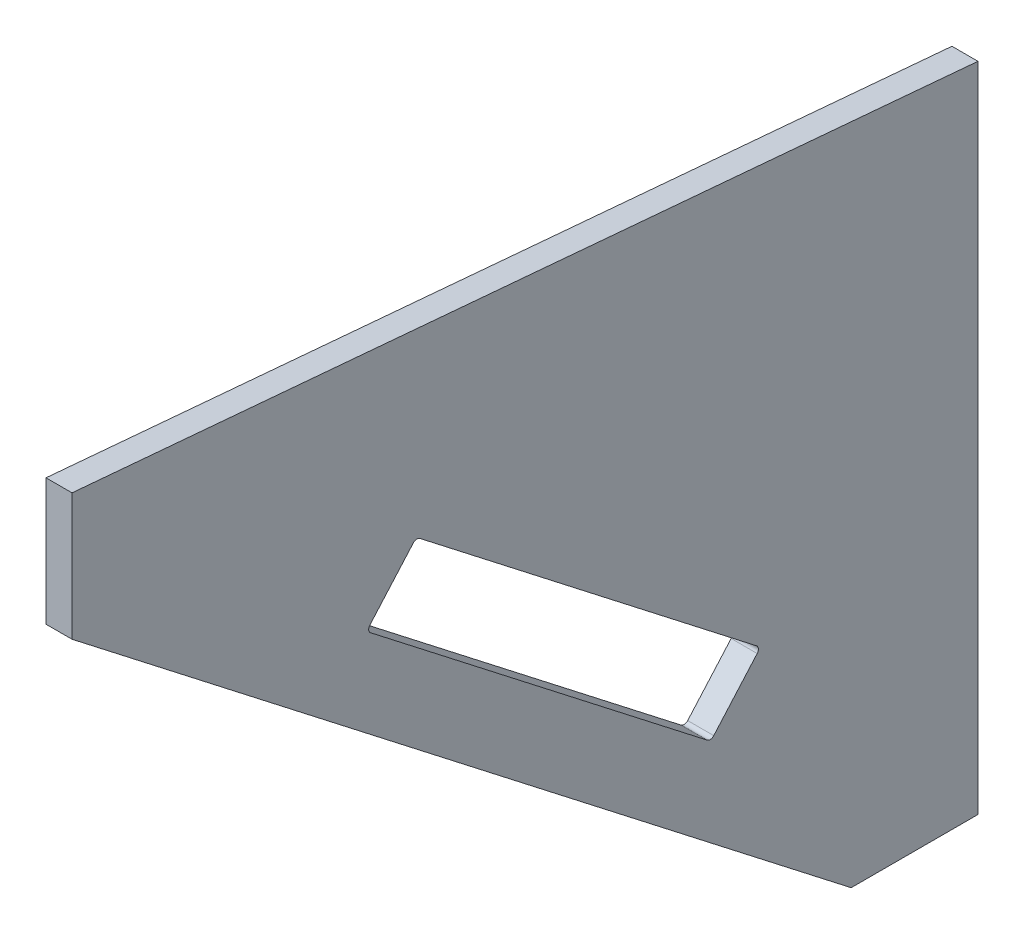
ISO-10303-21;
HEADER;
FILE_DESCRIPTION(('STEP AP214'),'2;1');
FILE_NAME('part.step','',(''),(''),'','','');
FILE_SCHEMA(('AUTOMOTIVE_DESIGN { 1 0 10303 214 1 1 1 1 }'));
ENDSEC;
DATA;
#1=APPLICATION_CONTEXT('core data for automotive mechanical design processes');
#2=APPLICATION_PROTOCOL_DEFINITION('international standard','automotive_design',2000,#1);
#3=PRODUCT_CONTEXT('',#1,'mechanical');
#4=PRODUCT('Part','Part','',(#3));
#5=PRODUCT_RELATED_PRODUCT_CATEGORY('part','',(#4));
#6=PRODUCT_DEFINITION_FORMATION('','',#4);
#7=PRODUCT_DEFINITION_CONTEXT('part definition',#1,'design');
#8=PRODUCT_DEFINITION('design','',#6,#7);
#9=PRODUCT_DEFINITION_SHAPE('','',#8);
#10=(LENGTH_UNIT() NAMED_UNIT(*) SI_UNIT(.MILLI.,.METRE.));
#11=(NAMED_UNIT(*) PLANE_ANGLE_UNIT() SI_UNIT($,.RADIAN.));
#12=(NAMED_UNIT(*) SI_UNIT($,.STERADIAN.) SOLID_ANGLE_UNIT());
#13=UNCERTAINTY_MEASURE_WITH_UNIT(LENGTH_MEASURE(1.E-05),#10,'distance_accuracy_value','');
#14=(GEOMETRIC_REPRESENTATION_CONTEXT(3) GLOBAL_UNCERTAINTY_ASSIGNED_CONTEXT((#13)) GLOBAL_UNIT_ASSIGNED_CONTEXT((#10,
#11,#12)) REPRESENTATION_CONTEXT('',''));
#15=CARTESIAN_POINT('',(0.,0.,0.));
#16=DIRECTION('',(0.,0.,1.));
#17=DIRECTION('',(1.,0.,0.));
#18=AXIS2_PLACEMENT_3D('',#15,#16,#17);
#19=CARTESIAN_POINT('',(18.25625,-457.2,0.));
#20=DIRECTION('',(0.,0.,1.));
#21=DIRECTION('',(1.,0.,0.));
#22=AXIS2_PLACEMENT_3D('',#19,#20,#21);
#23=PLANE('',#22);
#24=DIRECTION('',(0.,1.,0.));
#25=VECTOR('',#24,1.);
#26=CARTESIAN_POINT('',(0.,-457.2,0.));
#27=LINE('',#26,#25);
#28=CARTESIAN_POINT('',(0.,-457.2,0.));
#29=VERTEX_POINT('',#28);
#30=CARTESIAN_POINT('',(0.,0.,0.));
#31=VERTEX_POINT('',#30);
#32=EDGE_CURVE('E154',#29,#31,#27,.T.);
#33=ORIENTED_EDGE('',*,*,#32,.T.);
#34=DIRECTION('',(-1.,0.,0.));
#35=VECTOR('',#34,1.);
#36=CARTESIAN_POINT('',(18.25625,0.,0.));
#37=LINE('',#36,#35);
#38=CARTESIAN_POINT('',(18.25625,0.,0.));
#39=VERTEX_POINT('',#38);
#40=EDGE_CURVE('E135',#39,#31,#37,.T.);
#41=ORIENTED_EDGE('',*,*,#40,.F.);
#42=DIRECTION('',(0.,1.,0.));
#43=VECTOR('',#42,1.);
#44=CARTESIAN_POINT('',(18.25625,-457.2,0.));
#45=LINE('',#44,#43);
#46=CARTESIAN_POINT('',(18.25625,-457.2,0.));
#47=VERTEX_POINT('',#46);
#48=EDGE_CURVE('E142',#47,#39,#45,.T.);
#49=ORIENTED_EDGE('',*,*,#48,.F.);
#50=DIRECTION('',(-1.,0.,0.));
#51=VECTOR('',#50,1.);
#52=CARTESIAN_POINT('',(18.25625,-457.2,0.));
#53=LINE('',#52,#51);
#54=EDGE_CURVE('E230',#47,#29,#53,.T.);
#55=ORIENTED_EDGE('',*,*,#54,.T.);
#56=EDGE_LOOP('',(#33,#41,#49,#55));
#57=FACE_BOUND('',#56,.T.);
#58=ADVANCED_FACE('F35',(#57),#23,.F.);
#59=CARTESIAN_POINT('',(18.25625,0.,0.));
#60=DIRECTION('',(0.,-0.996194698091746,0.0871557427476543));
#61=DIRECTION('',(0.,-0.0871557427476543,-0.996194698091746));
#62=AXIS2_PLACEMENT_3D('',#59,#60,#61);
#63=PLANE('',#62);
#64=DIRECTION('',(0.,0.0871557427476543,0.996194698091746));
#65=VECTOR('',#64,1.);
#66=CARTESIAN_POINT('',(0.,0.,0.));
#67=LINE('',#66,#65);
#68=CARTESIAN_POINT('',(0.,55.5553013389593,635.));
#69=VERTEX_POINT('',#68);
#70=EDGE_CURVE('E232',#31,#69,#67,.T.);
#71=ORIENTED_EDGE('',*,*,#70,.T.);
#72=DIRECTION('',(-1.,0.,0.));
#73=VECTOR('',#72,1.);
#74=CARTESIAN_POINT('',(18.25625,55.5553013389593,635.));
#75=LINE('',#74,#73);
#76=CARTESIAN_POINT('',(18.25625,55.5553013389593,635.));
#77=VERTEX_POINT('',#76);
#78=EDGE_CURVE('E138',#77,#69,#75,.T.);
#79=ORIENTED_EDGE('',*,*,#78,.F.);
#80=DIRECTION('',(0.,0.0871557427476543,0.996194698091746));
#81=VECTOR('',#80,1.);
#82=CARTESIAN_POINT('',(18.25625,0.,0.));
#83=LINE('',#82,#81);
#84=EDGE_CURVE('E131',#39,#77,#83,.T.);
#85=ORIENTED_EDGE('',*,*,#84,.F.);
#86=ORIENTED_EDGE('',*,*,#40,.T.);
#87=EDGE_LOOP('',(#71,#79,#85,#86));
#88=FACE_BOUND('',#87,.T.);
#89=ADVANCED_FACE('F133',(#88),#63,.F.);
#90=CARTESIAN_POINT('',(18.25625,55.5553013389593,635.));
#91=DIRECTION('',(0.,0.,-1.));
#92=DIRECTION('',(-1.,0.,0.));
#93=AXIS2_PLACEMENT_3D('',#90,#91,#92);
#94=PLANE('',#93);
#95=DIRECTION('',(0.,-1.,0.));
#96=VECTOR('',#95,1.);
#97=CARTESIAN_POINT('',(0.,55.5553013389593,635.));
#98=LINE('',#97,#96);
#99=CARTESIAN_POINT('',(0.,-33.3375,635.));
#100=VERTEX_POINT('',#99);
#101=EDGE_CURVE('E234',#69,#100,#98,.T.);
#102=ORIENTED_EDGE('',*,*,#101,.T.);
#103=DIRECTION('',(-1.,0.,0.));
#104=VECTOR('',#103,1.);
#105=CARTESIAN_POINT('',(18.25625,-33.3375,635.));
#106=LINE('',#105,#104);
#107=CARTESIAN_POINT('',(18.25625,-33.3375,635.));
#108=VERTEX_POINT('',#107);
#109=EDGE_CURVE('E159',#108,#100,#106,.T.);
#110=ORIENTED_EDGE('',*,*,#109,.F.);
#111=DIRECTION('',(0.,-1.,0.));
#112=VECTOR('',#111,1.);
#113=CARTESIAN_POINT('',(18.25625,55.5553013389593,635.));
#114=LINE('',#113,#112);
#115=EDGE_CURVE('E141',#77,#108,#114,.T.);
#116=ORIENTED_EDGE('',*,*,#115,.F.);
#117=ORIENTED_EDGE('',*,*,#78,.T.);
#118=EDGE_LOOP('',(#102,#110,#116,#117));
#119=FACE_BOUND('',#118,.T.);
#120=ADVANCED_FACE('F261',(#119),#94,.F.);
#121=CARTESIAN_POINT('',(18.25625,-33.3375,635.));
#122=DIRECTION('',(0.,0.789970085295951,-0.613145385970985));
#123=DIRECTION('',(0.,0.613145385970985,0.789970085295951));
#124=AXIS2_PLACEMENT_3D('',#121,#122,#123);
#125=PLANE('',#124);
#126=DIRECTION('',(0.,-0.613145385970985,-0.789970085295951));
#127=VECTOR('',#126,1.);
#128=CARTESIAN_POINT('',(0.,-33.3375,635.));
#129=LINE('',#128,#127);
#130=CARTESIAN_POINT('',(0.,-457.2,88.9));
#131=VERTEX_POINT('',#130);
#132=EDGE_CURVE('E236',#100,#131,#129,.T.);
#133=ORIENTED_EDGE('',*,*,#132,.T.);
#134=DIRECTION('',(-1.,0.,0.));
#135=VECTOR('',#134,1.);
#136=CARTESIAN_POINT('',(18.25625,-457.2,88.9));
#137=LINE('',#136,#135);
#138=CARTESIAN_POINT('',(18.25625,-457.2,88.9));
#139=VERTEX_POINT('',#138);
#140=EDGE_CURVE('E240',#139,#131,#137,.T.);
#141=ORIENTED_EDGE('',*,*,#140,.F.);
#142=DIRECTION('',(0.,-0.613145385970985,-0.789970085295951));
#143=VECTOR('',#142,1.);
#144=CARTESIAN_POINT('',(18.25625,-33.3375,635.));
#145=LINE('',#144,#143);
#146=EDGE_CURVE('E227',#108,#139,#145,.T.);
#147=ORIENTED_EDGE('',*,*,#146,.F.);
#148=ORIENTED_EDGE('',*,*,#109,.T.);
#149=EDGE_LOOP('',(#133,#141,#147,#148));
#150=FACE_BOUND('',#149,.T.);
#151=ADVANCED_FACE('F247',(#150),#125,.F.);
#152=CARTESIAN_POINT('',(18.25625,-457.2,88.9));
#153=DIRECTION('',(0.,1.,0.));
#154=DIRECTION('',(0.,0.,1.));
#155=AXIS2_PLACEMENT_3D('',#152,#153,#154);
#156=PLANE('',#155);
#157=DIRECTION('',(0.,0.,-1.));
#158=VECTOR('',#157,1.);
#159=CARTESIAN_POINT('',(0.,-457.2,88.9));
#160=LINE('',#159,#158);
#161=EDGE_CURVE('E151',#131,#29,#160,.T.);
#162=ORIENTED_EDGE('',*,*,#161,.T.);
#163=ORIENTED_EDGE('',*,*,#54,.F.);
#164=DIRECTION('',(0.,0.,-1.));
#165=VECTOR('',#164,1.);
#166=CARTESIAN_POINT('',(18.25625,-457.2,88.9));
#167=LINE('',#166,#165);
#168=EDGE_CURVE('E147',#139,#47,#167,.T.);
#169=ORIENTED_EDGE('',*,*,#168,.F.);
#170=ORIENTED_EDGE('',*,*,#140,.T.);
#171=EDGE_LOOP('',(#162,#163,#169,#170));
#172=FACE_BOUND('',#171,.T.);
#173=ADVANCED_FACE('F253',(#172),#156,.F.);
#174=CARTESIAN_POINT('',(18.25625,0.,0.));
#175=DIRECTION('',(-1.,0.,0.));
#176=DIRECTION('',(0.,0.,1.));
#177=AXIS2_PLACEMENT_3D('',#174,#175,#176);
#178=PLANE('',#177);
#179=DIRECTION('',(0.,0.750713516922755,-0.660627894892025));
#180=VECTOR('',#179,1.);
#181=CARTESIAN_POINT('',(18.25625,-92.075,393.7));
#182=LINE('',#181,#180);
#183=CARTESIAN_POINT('',(18.25625,-129.065408521815,426.251559499197));
#184=VERTEX_POINT('',#183);
#185=CARTESIAN_POINT('',(18.25625,-94.4596437612586,395.798486509908));
#186=VERTEX_POINT('',#185);
#187=EDGE_CURVE('E212',#184,#186,#182,.T.);
#188=ORIENTED_EDGE('',*,*,#187,.T.);
#189=CARTESIAN_POINT('',(18.25625,-96.6913769157829,393.262426107039));
#190=DIRECTION('',(-1.,0.,0.));
#191=DIRECTION('',(0.,0.,1.));
#192=AXIS2_PLACEMENT_3D('',#189,#190,#191);
#193=CIRCLE('',#192,3.3782);
#194=CARTESIAN_POINT('',(18.25625,-94.0228977400753,391.190843589056));
#195=VERTEX_POINT('',#194);
#196=EDGE_CURVE('E181',#186,#195,#193,.T.);
#197=ORIENTED_EDGE('',*,*,#196,.T.);
#198=DIRECTION('',(0.,-0.613220803381541,-0.789911543338934));
#199=VECTOR('',#198,1.);
#200=CARTESIAN_POINT('',(18.25625,-92.075,393.7));
#201=LINE('',#200,#199);
#202=CARTESIAN_POINT('',(18.25625,-277.196879147953,155.237918385688));
#203=VERTEX_POINT('',#202);
#204=EDGE_CURVE('E214',#195,#203,#201,.T.);
#205=ORIENTED_EDGE('',*,*,#204,.T.);
#206=CARTESIAN_POINT('',(18.25625,-279.865358323661,157.309500903671));
#207=DIRECTION('',(-1.,0.,0.));
#208=DIRECTION('',(0.,0.,1.));
#209=AXIS2_PLACEMENT_3D('',#206,#207,#208);
#210=CIRCLE('',#209,3.3782);
#211=CARTESIAN_POINT('',(18.25625,-282.097091478185,154.773440500803));
#212=VERTEX_POINT('',#211);
#213=EDGE_CURVE('E57',#203,#212,#210,.T.);
#214=ORIENTED_EDGE('',*,*,#213,.T.);
#215=DIRECTION('',(0.,-0.750713516922755,0.660627894892025));
#216=VECTOR('',#215,1.);
#217=CARTESIAN_POINT('',(18.25625,-279.4,152.4));
#218=LINE('',#217,#216);
#219=CARTESIAN_POINT('',(18.25625,-316.702856238741,185.226513490092));
#220=VERTEX_POINT('',#219);
#221=EDGE_CURVE('E208',#212,#220,#218,.T.);
#222=ORIENTED_EDGE('',*,*,#221,.T.);
#223=CARTESIAN_POINT('',(18.25625,-314.471123084217,187.762573892961));
#224=DIRECTION('',(-1.,0.,0.));
#225=DIRECTION('',(0.,0.,1.));
#226=AXIS2_PLACEMENT_3D('',#223,#224,#225);
#227=CIRCLE('',#226,3.3782);
#228=CARTESIAN_POINT('',(18.25625,-317.139602259925,189.834156410944));
#229=VERTEX_POINT('',#228);
#230=EDGE_CURVE('E11',#220,#229,#227,.T.);
#231=ORIENTED_EDGE('',*,*,#230,.T.);
#232=DIRECTION('',(0.,0.613220803381541,0.789911543338934));
#233=VECTOR('',#232,1.);
#234=CARTESIAN_POINT('',(18.25625,-131.7625,428.625));
#235=LINE('',#234,#233);
#236=CARTESIAN_POINT('',(18.25625,-133.965620852047,425.787081614312));
#237=VERTEX_POINT('',#236);
#238=EDGE_CURVE('E206',#229,#237,#235,.T.);
#239=ORIENTED_EDGE('',*,*,#238,.T.);
#240=CARTESIAN_POINT('',(18.25625,-131.297141676339,423.715499096329));
#241=DIRECTION('',(-1.,0.,0.));
#242=DIRECTION('',(0.,0.,1.));
#243=AXIS2_PLACEMENT_3D('',#240,#241,#242);
#244=CIRCLE('',#243,3.3782);
#245=EDGE_CURVE('E185',#237,#184,#244,.T.);
#246=ORIENTED_EDGE('',*,*,#245,.T.);
#247=EDGE_LOOP('',(#188,#197,#205,#214,#222,#231,#239,#246));
#248=FACE_BOUND('',#247,.T.);
#249=ORIENTED_EDGE('',*,*,#48,.T.);
#250=ORIENTED_EDGE('',*,*,#84,.T.);
#251=ORIENTED_EDGE('',*,*,#115,.T.);
#252=ORIENTED_EDGE('',*,*,#146,.T.);
#253=ORIENTED_EDGE('',*,*,#168,.T.);
#254=EDGE_LOOP('',(#249,#250,#251,#252,#253));
#255=FACE_BOUND('',#254,.T.);
#256=ADVANCED_FACE('F145',(#248,#255),#178,.F.);
#257=CARTESIAN_POINT('',(0.,0.,0.));
#258=DIRECTION('',(-1.,0.,0.));
#259=DIRECTION('',(0.,0.,1.));
#260=AXIS2_PLACEMENT_3D('',#257,#258,#259);
#261=PLANE('',#260);
#262=DIRECTION('',(0.,-0.750713516922755,0.660627894892025));
#263=VECTOR('',#262,1.);
#264=CARTESIAN_POINT('',(0.,-279.4,152.4));
#265=LINE('',#264,#263);
#266=CARTESIAN_POINT('',(0.,-282.097091478185,154.773440500803));
#267=VERTEX_POINT('',#266);
#268=CARTESIAN_POINT('',(0.,-316.702856238741,185.226513490092));
#269=VERTEX_POINT('',#268);
#270=EDGE_CURVE('E194',#267,#269,#265,.T.);
#271=ORIENTED_EDGE('',*,*,#270,.F.);
#272=CARTESIAN_POINT('',(0.,-279.865358323661,157.309500903671));
#273=DIRECTION('',(-1.,0.,0.));
#274=DIRECTION('',(0.,0.,1.));
#275=AXIS2_PLACEMENT_3D('',#272,#273,#274);
#276=CIRCLE('',#275,3.3782);
#277=CARTESIAN_POINT('',(0.,-277.196879147953,155.237918385688));
#278=VERTEX_POINT('',#277);
#279=EDGE_CURVE('E187',#267,#278,#276,.F.);
#280=ORIENTED_EDGE('',*,*,#279,.T.);
#281=DIRECTION('',(0.,-0.613220803381541,-0.789911543338934));
#282=VECTOR('',#281,1.);
#283=CARTESIAN_POINT('',(0.,-92.075,393.7));
#284=LINE('',#283,#282);
#285=CARTESIAN_POINT('',(0.,-94.0228977400753,391.190843589056));
#286=VERTEX_POINT('',#285);
#287=EDGE_CURVE('E216',#286,#278,#284,.T.);
#288=ORIENTED_EDGE('',*,*,#287,.F.);
#289=CARTESIAN_POINT('',(0.,-96.6913769157829,393.262426107039));
#290=DIRECTION('',(-1.,0.,0.));
#291=DIRECTION('',(0.,0.,1.));
#292=AXIS2_PLACEMENT_3D('',#289,#290,#291);
#293=CIRCLE('',#292,3.3782);
#294=CARTESIAN_POINT('',(0.,-94.4596437612586,395.798486509908));
#295=VERTEX_POINT('',#294);
#296=EDGE_CURVE('E179',#286,#295,#293,.F.);
#297=ORIENTED_EDGE('',*,*,#296,.T.);
#298=DIRECTION('',(0.,0.750713516922755,-0.660627894892025));
#299=VECTOR('',#298,1.);
#300=CARTESIAN_POINT('',(0.,-92.075,393.7));
#301=LINE('',#300,#299);
#302=CARTESIAN_POINT('',(0.,-129.065408521815,426.251559499197));
#303=VERTEX_POINT('',#302);
#304=EDGE_CURVE('E221',#303,#295,#301,.T.);
#305=ORIENTED_EDGE('',*,*,#304,.F.);
#306=CARTESIAN_POINT('',(0.,-131.297141676339,423.715499096329));
#307=DIRECTION('',(-1.,0.,0.));
#308=DIRECTION('',(0.,0.,1.));
#309=AXIS2_PLACEMENT_3D('',#306,#307,#308);
#310=CIRCLE('',#309,3.3782);
#311=CARTESIAN_POINT('',(0.,-133.965620852047,425.787081614312));
#312=VERTEX_POINT('',#311);
#313=EDGE_CURVE('E183',#303,#312,#310,.F.);
#314=ORIENTED_EDGE('',*,*,#313,.T.);
#315=DIRECTION('',(0.,0.613220803381541,0.789911543338934));
#316=VECTOR('',#315,1.);
#317=CARTESIAN_POINT('',(0.,-131.7625,428.625));
#318=LINE('',#317,#316);
#319=CARTESIAN_POINT('',(0.,-317.139602259925,189.834156410944));
#320=VERTEX_POINT('',#319);
#321=EDGE_CURVE('E196',#320,#312,#318,.T.);
#322=ORIENTED_EDGE('',*,*,#321,.F.);
#323=CARTESIAN_POINT('',(0.,-314.471123084217,187.762573892961));
#324=DIRECTION('',(-1.,0.,0.));
#325=DIRECTION('',(0.,0.,1.));
#326=AXIS2_PLACEMENT_3D('',#323,#324,#325);
#327=CIRCLE('',#326,3.3782);
#328=EDGE_CURVE('E43',#320,#269,#327,.F.);
#329=ORIENTED_EDGE('',*,*,#328,.T.);
#330=EDGE_LOOP('',(#271,#280,#288,#297,#305,#314,#322,#329));
#331=FACE_BOUND('',#330,.T.);
#332=ORIENTED_EDGE('',*,*,#32,.F.);
#333=ORIENTED_EDGE('',*,*,#161,.F.);
#334=ORIENTED_EDGE('',*,*,#132,.F.);
#335=ORIENTED_EDGE('',*,*,#101,.F.);
#336=ORIENTED_EDGE('',*,*,#70,.F.);
#337=EDGE_LOOP('',(#332,#333,#334,#335,#336));
#338=FACE_BOUND('',#337,.T.);
#339=ADVANCED_FACE('F192',(#331,#338),#261,.T.);
#340=CARTESIAN_POINT('',(18.25625,-279.4,152.4));
#341=DIRECTION('',(0.,-0.660627894892025,-0.750713516922755));
#342=DIRECTION('',(0.,0.750713516922755,-0.660627894892025));
#343=AXIS2_PLACEMENT_3D('',#340,#341,#342);
#344=PLANE('',#343);
#345=ORIENTED_EDGE('',*,*,#221,.F.);
#346=DIRECTION('',(-1.,0.,0.));
#347=VECTOR('',#346,1.);
#348=CARTESIAN_POINT('',(0.,-282.097091478185,154.773440500803));
#349=LINE('',#348,#347);
#350=EDGE_CURVE('E176',#212,#267,#349,.T.);
#351=ORIENTED_EDGE('',*,*,#350,.T.);
#352=ORIENTED_EDGE('',*,*,#270,.T.);
#353=DIRECTION('',(-1.,0.,0.));
#354=VECTOR('',#353,1.);
#355=CARTESIAN_POINT('',(18.25625,-316.702856238741,185.226513490092));
#356=LINE('',#355,#354);
#357=EDGE_CURVE('E50',#269,#220,#356,.F.);
#358=ORIENTED_EDGE('',*,*,#357,.T.);
#359=EDGE_LOOP('',(#345,#351,#352,#358));
#360=FACE_BOUND('',#359,.T.);
#361=ADVANCED_FACE('F199',(#360),#344,.F.);
#362=CARTESIAN_POINT('',(18.25625,-92.075,393.7));
#363=DIRECTION('',(0.,0.789911543338935,-0.613220803381541));
#364=DIRECTION('',(0.,0.613220803381541,0.789911543338935));
#365=AXIS2_PLACEMENT_3D('',#362,#363,#364);
#366=PLANE('',#365);
#367=ORIENTED_EDGE('',*,*,#204,.F.);
#368=DIRECTION('',(-1.,0.,0.));
#369=VECTOR('',#368,1.);
#370=CARTESIAN_POINT('',(0.,-94.0228977400753,391.190843589056));
#371=LINE('',#370,#369);
#372=EDGE_CURVE('E157',#195,#286,#371,.T.);
#373=ORIENTED_EDGE('',*,*,#372,.T.);
#374=ORIENTED_EDGE('',*,*,#287,.T.);
#375=DIRECTION('',(-1.,0.,0.));
#376=VECTOR('',#375,1.);
#377=CARTESIAN_POINT('',(18.25625,-277.196879147953,155.237918385688));
#378=LINE('',#377,#376);
#379=EDGE_CURVE('E155',#278,#203,#378,.F.);
#380=ORIENTED_EDGE('',*,*,#379,.T.);
#381=EDGE_LOOP('',(#367,#373,#374,#380));
#382=FACE_BOUND('',#381,.T.);
#383=ADVANCED_FACE('F289',(#382),#366,.F.);
#384=CARTESIAN_POINT('',(18.25625,-92.075,393.7));
#385=DIRECTION('',(0.,0.660627894892025,0.750713516922755));
#386=DIRECTION('',(0.,-0.750713516922755,0.660627894892025));
#387=AXIS2_PLACEMENT_3D('',#384,#385,#386);
#388=PLANE('',#387);
#389=ORIENTED_EDGE('',*,*,#304,.T.);
#390=DIRECTION('',(-1.,0.,0.));
#391=VECTOR('',#390,1.);
#392=CARTESIAN_POINT('',(18.25625,-94.4596437612586,395.798486509908));
#393=LINE('',#392,#391);
#394=EDGE_CURVE('E168',#295,#186,#393,.F.);
#395=ORIENTED_EDGE('',*,*,#394,.T.);
#396=ORIENTED_EDGE('',*,*,#187,.F.);
#397=DIRECTION('',(-1.,0.,0.));
#398=VECTOR('',#397,1.);
#399=CARTESIAN_POINT('',(0.,-129.065408521815,426.251559499197));
#400=LINE('',#399,#398);
#401=EDGE_CURVE('E165',#184,#303,#400,.T.);
#402=ORIENTED_EDGE('',*,*,#401,.T.);
#403=EDGE_LOOP('',(#389,#395,#396,#402));
#404=FACE_BOUND('',#403,.T.);
#405=ADVANCED_FACE('F295',(#404),#388,.F.);
#406=CARTESIAN_POINT('',(18.25625,-131.7625,428.625));
#407=DIRECTION('',(0.,-0.789911543338935,0.613220803381541));
#408=DIRECTION('',(0.,-0.613220803381541,-0.789911543338935));
#409=AXIS2_PLACEMENT_3D('',#406,#407,#408);
#410=PLANE('',#409);
#411=ORIENTED_EDGE('',*,*,#321,.T.);
#412=DIRECTION('',(-1.,0.,0.));
#413=VECTOR('',#412,1.);
#414=CARTESIAN_POINT('',(18.25625,-133.965620852047,425.787081614312));
#415=LINE('',#414,#413);
#416=EDGE_CURVE('E173',#312,#237,#415,.F.);
#417=ORIENTED_EDGE('',*,*,#416,.T.);
#418=ORIENTED_EDGE('',*,*,#238,.F.);
#419=DIRECTION('',(-1.,0.,0.));
#420=VECTOR('',#419,1.);
#421=CARTESIAN_POINT('',(0.,-317.139602259925,189.834156410944));
#422=LINE('',#421,#420);
#423=EDGE_CURVE('E170',#229,#320,#422,.T.);
#424=ORIENTED_EDGE('',*,*,#423,.T.);
#425=EDGE_LOOP('',(#411,#417,#418,#424));
#426=FACE_BOUND('',#425,.T.);
#427=ADVANCED_FACE('F210',(#426),#410,.F.);
#428=CARTESIAN_POINT('',(18.25625,-96.6913769157829,393.262426107039));
#429=DIRECTION('',(1.,0.,0.));
#430=DIRECTION('',(0.,0.,-1.));
#431=AXIS2_PLACEMENT_3D('',#428,#429,#430);
#432=CYLINDRICAL_SURFACE('',#431,3.3782);
#433=ORIENTED_EDGE('',*,*,#196,.F.);
#434=ORIENTED_EDGE('',*,*,#394,.F.);
#435=ORIENTED_EDGE('',*,*,#296,.F.);
#436=ORIENTED_EDGE('',*,*,#372,.F.);
#437=EDGE_LOOP('',(#433,#434,#435,#436));
#438=FACE_BOUND('',#437,.T.);
#439=ADVANCED_FACE('F272',(#438),#432,.F.);
#440=CARTESIAN_POINT('',(18.25625,-131.297141676339,423.715499096329));
#441=DIRECTION('',(1.,0.,0.));
#442=DIRECTION('',(0.,0.,-1.));
#443=AXIS2_PLACEMENT_3D('',#440,#441,#442);
#444=CYLINDRICAL_SURFACE('',#443,3.3782);
#445=ORIENTED_EDGE('',*,*,#245,.F.);
#446=ORIENTED_EDGE('',*,*,#416,.F.);
#447=ORIENTED_EDGE('',*,*,#313,.F.);
#448=ORIENTED_EDGE('',*,*,#401,.F.);
#449=EDGE_LOOP('',(#445,#446,#447,#448));
#450=FACE_BOUND('',#449,.T.);
#451=ADVANCED_FACE('F275',(#450),#444,.F.);
#452=CARTESIAN_POINT('',(18.25625,-279.865358323661,157.309500903671));
#453=DIRECTION('',(1.,0.,0.));
#454=DIRECTION('',(0.,0.,-1.));
#455=AXIS2_PLACEMENT_3D('',#452,#453,#454);
#456=CYLINDRICAL_SURFACE('',#455,3.3782);
#457=ORIENTED_EDGE('',*,*,#213,.F.);
#458=ORIENTED_EDGE('',*,*,#379,.F.);
#459=ORIENTED_EDGE('',*,*,#279,.F.);
#460=ORIENTED_EDGE('',*,*,#350,.F.);
#461=EDGE_LOOP('',(#457,#458,#459,#460));
#462=FACE_BOUND('',#461,.T.);
#463=ADVANCED_FACE('F278',(#462),#456,.F.);
#464=CARTESIAN_POINT('',(18.25625,-314.471123084217,187.762573892961));
#465=DIRECTION('',(1.,0.,0.));
#466=DIRECTION('',(0.,0.,-1.));
#467=AXIS2_PLACEMENT_3D('',#464,#465,#466);
#468=CYLINDRICAL_SURFACE('',#467,3.3782);
#469=ORIENTED_EDGE('',*,*,#230,.F.);
#470=ORIENTED_EDGE('',*,*,#357,.F.);
#471=ORIENTED_EDGE('',*,*,#328,.F.);
#472=ORIENTED_EDGE('',*,*,#423,.F.);
#473=EDGE_LOOP('',(#469,#470,#471,#472));
#474=FACE_BOUND('',#473,.T.);
#475=ADVANCED_FACE('F37',(#474),#468,.F.);
#476=CLOSED_SHELL('',(#58,#89,#120,#151,#173,#256,#339,#361,#383,#405,#427,#439,#451,#463,#475));
#477=MANIFOLD_SOLID_BREP('B2',#476);
#478=ADVANCED_BREP_SHAPE_REPRESENTATION('',(#18,#477),#14);
#479=SHAPE_DEFINITION_REPRESENTATION(#9,#478);
ENDSEC;
END-ISO-10303-21;
